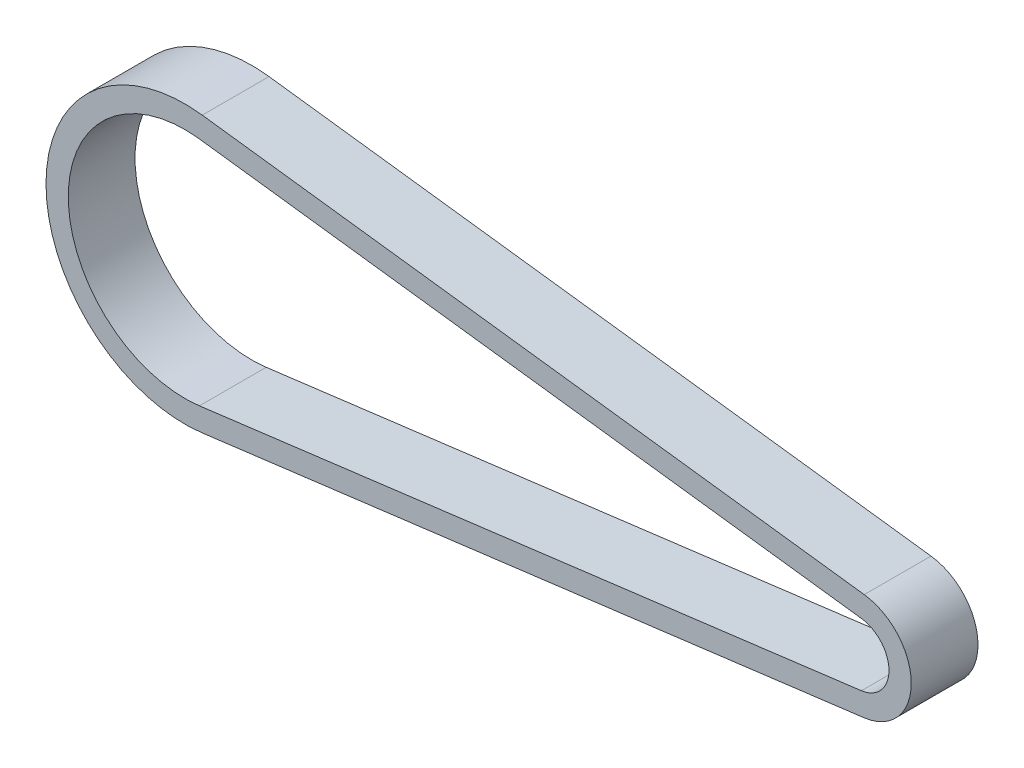
ISO-10303-21;
HEADER;
FILE_DESCRIPTION(('STEP AP214'),'2;1');
FILE_NAME('part.step','',(''),(''),'','','');
FILE_SCHEMA(('AUTOMOTIVE_DESIGN { 1 0 10303 214 1 1 1 1 }'));
ENDSEC;
DATA;
#1=APPLICATION_CONTEXT('core data for automotive mechanical design processes');
#2=APPLICATION_PROTOCOL_DEFINITION('international standard','automotive_design',2000,#1);
#3=PRODUCT_CONTEXT('',#1,'mechanical');
#4=PRODUCT('Part','Part','',(#3));
#5=PRODUCT_RELATED_PRODUCT_CATEGORY('part','',(#4));
#6=PRODUCT_DEFINITION_FORMATION('','',#4);
#7=PRODUCT_DEFINITION_CONTEXT('part definition',#1,'design');
#8=PRODUCT_DEFINITION('design','',#6,#7);
#9=PRODUCT_DEFINITION_SHAPE('','',#8);
#10=(LENGTH_UNIT() NAMED_UNIT(*) SI_UNIT(.MILLI.,.METRE.));
#11=(NAMED_UNIT(*) PLANE_ANGLE_UNIT() SI_UNIT($,.RADIAN.));
#12=(NAMED_UNIT(*) SI_UNIT($,.STERADIAN.) SOLID_ANGLE_UNIT());
#13=UNCERTAINTY_MEASURE_WITH_UNIT(LENGTH_MEASURE(1.E-05),#10,'distance_accuracy_value','');
#14=(GEOMETRIC_REPRESENTATION_CONTEXT(3) GLOBAL_UNCERTAINTY_ASSIGNED_CONTEXT((#13)) GLOBAL_UNIT_ASSIGNED_CONTEXT((#10,
#11,#12)) REPRESENTATION_CONTEXT('',''));
#15=CARTESIAN_POINT('',(0.,0.,0.));
#16=DIRECTION('',(0.,0.,1.));
#17=DIRECTION('',(1.,0.,0.));
#18=AXIS2_PLACEMENT_3D('',#15,#16,#17);
#19=CARTESIAN_POINT('',(90.67602,0.,4.5));
#20=DIRECTION('',(0.,0.,-1.));
#21=DIRECTION('',(-1.,0.,0.));
#22=AXIS2_PLACEMENT_3D('',#19,#20,#21);
#23=CYLINDRICAL_SURFACE('',#22,4.25);
#24=CARTESIAN_POINT('',(90.67602,0.,-4.5));
#25=DIRECTION('',(0.,0.,1.));
#26=DIRECTION('',(1.,0.,0.));
#27=AXIS2_PLACEMENT_3D('',#24,#25,#26);
#28=CIRCLE('',#27,4.25);
#29=CARTESIAN_POINT('',(91.2126833868579,-4.21598059877013,-4.5));
#30=VERTEX_POINT('',#29);
#31=CARTESIAN_POINT('',(91.2126833868579,4.21598059877013,-4.5));
#32=VERTEX_POINT('',#31);
#33=EDGE_CURVE('E143',#30,#32,#28,.T.);
#34=ORIENTED_EDGE('',*,*,#33,.F.);
#35=DIRECTION('',(0.,0.,-1.));
#36=VECTOR('',#35,1.);
#37=CARTESIAN_POINT('',(91.2126833868579,-4.21598059877013,4.5));
#38=LINE('',#37,#36);
#39=CARTESIAN_POINT('',(91.2126833868579,-4.21598059877013,4.5));
#40=VERTEX_POINT('',#39);
#41=EDGE_CURVE('E11',#40,#30,#38,.T.);
#42=ORIENTED_EDGE('',*,*,#41,.F.);
#43=CARTESIAN_POINT('',(90.67602,0.,4.5));
#44=DIRECTION('',(0.,0.,1.));
#45=DIRECTION('',(1.,0.,0.));
#46=AXIS2_PLACEMENT_3D('',#43,#44,#45);
#47=CIRCLE('',#46,4.25);
#48=CARTESIAN_POINT('',(91.2126833868579,4.21598059877013,4.5));
#49=VERTEX_POINT('',#48);
#50=EDGE_CURVE('E114',#40,#49,#47,.T.);
#51=ORIENTED_EDGE('',*,*,#50,.T.);
#52=DIRECTION('',(0.,0.,-1.));
#53=VECTOR('',#52,1.);
#54=CARTESIAN_POINT('',(91.2126833868579,4.21598059877013,4.5));
#55=LINE('',#54,#53);
#56=EDGE_CURVE('E88',#49,#32,#55,.T.);
#57=ORIENTED_EDGE('',*,*,#56,.T.);
#58=EDGE_LOOP('',(#34,#42,#51,#57));
#59=FACE_BOUND('',#58,.T.);
#60=ADVANCED_FACE('F35',(#59),#23,.F.);
#61=CARTESIAN_POINT('',(1.98249768792234,-15.5743283295744,4.5));
#62=DIRECTION('',(0.126273738084226,-0.991995435004737,0.));
#63=DIRECTION('',(0.991995435004737,0.126273738084226,0.));
#64=AXIS2_PLACEMENT_3D('',#61,#62,#63);
#65=PLANE('',#64);
#66=DIRECTION('',(-0.991995435004737,-0.126273738084226,0.));
#67=VECTOR('',#66,1.);
#68=CARTESIAN_POINT('',(1.98249768792234,-15.5743283295744,-4.5));
#69=LINE('',#68,#67);
#70=CARTESIAN_POINT('',(1.98249768792231,-15.5743283295744,-4.5));
#71=VERTEX_POINT('',#70);
#72=EDGE_CURVE('E120',#30,#71,#69,.T.);
#73=ORIENTED_EDGE('',*,*,#72,.T.);
#74=DIRECTION('',(0.,0.,-1.));
#75=VECTOR('',#74,1.);
#76=CARTESIAN_POINT('',(1.98249768792231,-15.5743283295744,4.5));
#77=LINE('',#76,#75);
#78=CARTESIAN_POINT('',(1.98249768792231,-15.5743283295744,4.5));
#79=VERTEX_POINT('',#78);
#80=EDGE_CURVE('E45',#79,#71,#77,.T.);
#81=ORIENTED_EDGE('',*,*,#80,.F.);
#82=DIRECTION('',(-0.991995435004737,-0.126273738084226,0.));
#83=VECTOR('',#82,1.);
#84=CARTESIAN_POINT('',(1.98249768792234,-15.5743283295744,4.5));
#85=LINE('',#84,#83);
#86=EDGE_CURVE('E109',#40,#79,#85,.T.);
#87=ORIENTED_EDGE('',*,*,#86,.F.);
#88=ORIENTED_EDGE('',*,*,#41,.T.);
#89=EDGE_LOOP('',(#73,#81,#87,#88));
#90=FACE_BOUND('',#89,.T.);
#91=ADVANCED_FACE('F118',(#90),#65,.F.);
#92=CARTESIAN_POINT('',(0.,0.,4.5));
#93=DIRECTION('',(0.,0.,-1.));
#94=DIRECTION('',(-1.,0.,0.));
#95=AXIS2_PLACEMENT_3D('',#92,#93,#94);
#96=CYLINDRICAL_SURFACE('',#95,15.7);
#97=CARTESIAN_POINT('',(0.,0.,-4.5));
#98=DIRECTION('',(0.,0.,1.));
#99=DIRECTION('',(1.,0.,0.));
#100=AXIS2_PLACEMENT_3D('',#97,#98,#99);
#101=CIRCLE('',#100,15.7);
#102=CARTESIAN_POINT('',(1.98249768792234,15.5743283295744,-4.5));
#103=VERTEX_POINT('',#102);
#104=EDGE_CURVE('E147',#103,#71,#101,.T.);
#105=ORIENTED_EDGE('',*,*,#104,.F.);
#106=DIRECTION('',(0.,0.,-1.));
#107=VECTOR('',#106,1.);
#108=CARTESIAN_POINT('',(1.98249768792234,15.5743283295744,4.5));
#109=LINE('',#108,#107);
#110=CARTESIAN_POINT('',(1.98249768792234,15.5743283295744,4.5));
#111=VERTEX_POINT('',#110);
#112=EDGE_CURVE('E81',#111,#103,#109,.T.);
#113=ORIENTED_EDGE('',*,*,#112,.F.);
#114=CARTESIAN_POINT('',(0.,0.,4.5));
#115=DIRECTION('',(0.,0.,1.));
#116=DIRECTION('',(1.,0.,0.));
#117=AXIS2_PLACEMENT_3D('',#114,#115,#116);
#118=CIRCLE('',#117,15.7);
#119=EDGE_CURVE('E113',#111,#79,#118,.T.);
#120=ORIENTED_EDGE('',*,*,#119,.T.);
#121=ORIENTED_EDGE('',*,*,#80,.T.);
#122=EDGE_LOOP('',(#105,#113,#120,#121));
#123=FACE_BOUND('',#122,.T.);
#124=ADVANCED_FACE('F125',(#123),#96,.F.);
#125=CARTESIAN_POINT('',(2.36131890217502,18.5503146345886,4.5));
#126=DIRECTION('',(0.126273738084226,0.991995435004737,0.));
#127=DIRECTION('',(-0.991995435004737,0.126273738084226,0.));
#128=AXIS2_PLACEMENT_3D('',#125,#126,#127);
#129=PLANE('',#128);
#130=DIRECTION('',(0.991995435004737,-0.126273738084226,0.));
#131=VECTOR('',#130,1.);
#132=CARTESIAN_POINT('',(2.36131890217502,18.5503146345886,-4.5));
#133=LINE('',#132,#131);
#134=CARTESIAN_POINT('',(2.36131890217502,18.5503146345886,-4.5));
#135=VERTEX_POINT('',#134);
#136=CARTESIAN_POINT('',(91.5915046011106,7.19196690378434,-4.5));
#137=VERTEX_POINT('',#136);
#138=EDGE_CURVE('E131',#135,#137,#133,.T.);
#139=ORIENTED_EDGE('',*,*,#138,.F.);
#140=DIRECTION('',(0.,0.,-1.));
#141=VECTOR('',#140,1.);
#142=CARTESIAN_POINT('',(2.36131890217502,18.5503146345886,4.5));
#143=LINE('',#142,#141);
#144=CARTESIAN_POINT('',(2.36131890217502,18.5503146345886,4.5));
#145=VERTEX_POINT('',#144);
#146=EDGE_CURVE('E39',#145,#135,#143,.T.);
#147=ORIENTED_EDGE('',*,*,#146,.F.);
#148=DIRECTION('',(0.991995435004737,-0.126273738084226,0.));
#149=VECTOR('',#148,1.);
#150=CARTESIAN_POINT('',(2.36131890217502,18.5503146345886,4.5));
#151=LINE('',#150,#149);
#152=CARTESIAN_POINT('',(91.5915046011106,7.19196690378434,4.5));
#153=VERTEX_POINT('',#152);
#154=EDGE_CURVE('E151',#145,#153,#151,.T.);
#155=ORIENTED_EDGE('',*,*,#154,.T.);
#156=DIRECTION('',(0.,0.,-1.));
#157=VECTOR('',#156,1.);
#158=CARTESIAN_POINT('',(91.5915046011106,7.19196690378434,4.5));
#159=LINE('',#158,#157);
#160=EDGE_CURVE('E127',#153,#137,#159,.T.);
#161=ORIENTED_EDGE('',*,*,#160,.T.);
#162=EDGE_LOOP('',(#139,#147,#155,#161));
#163=FACE_BOUND('',#162,.T.);
#164=ADVANCED_FACE('F37',(#163),#129,.T.);
#165=CARTESIAN_POINT('',(0.,0.,4.5));
#166=DIRECTION('',(0.,0.,-1.));
#167=DIRECTION('',(-1.,0.,0.));
#168=AXIS2_PLACEMENT_3D('',#165,#166,#167);
#169=CYLINDRICAL_SURFACE('',#168,18.7);
#170=CARTESIAN_POINT('',(0.,0.,-4.5));
#171=DIRECTION('',(0.,0.,1.));
#172=DIRECTION('',(1.,0.,0.));
#173=AXIS2_PLACEMENT_3D('',#170,#171,#172);
#174=CIRCLE('',#173,18.7);
#175=CARTESIAN_POINT('',(2.36131890217499,-18.5503146345886,-4.5));
#176=VERTEX_POINT('',#175);
#177=EDGE_CURVE('E134',#135,#176,#174,.T.);
#178=ORIENTED_EDGE('',*,*,#177,.T.);
#179=DIRECTION('',(0.,0.,-1.));
#180=VECTOR('',#179,1.);
#181=CARTESIAN_POINT('',(2.36131890217499,-18.5503146345886,4.5));
#182=LINE('',#181,#180);
#183=CARTESIAN_POINT('',(2.36131890217499,-18.5503146345886,4.5));
#184=VERTEX_POINT('',#183);
#185=EDGE_CURVE('E156',#184,#176,#182,.T.);
#186=ORIENTED_EDGE('',*,*,#185,.F.);
#187=CARTESIAN_POINT('',(0.,0.,4.5));
#188=DIRECTION('',(0.,0.,1.));
#189=DIRECTION('',(1.,0.,0.));
#190=AXIS2_PLACEMENT_3D('',#187,#188,#189);
#191=CIRCLE('',#190,18.7);
#192=EDGE_CURVE('E164',#145,#184,#191,.T.);
#193=ORIENTED_EDGE('',*,*,#192,.F.);
#194=ORIENTED_EDGE('',*,*,#146,.T.);
#195=EDGE_LOOP('',(#178,#186,#193,#194));
#196=FACE_BOUND('',#195,.T.);
#197=ADVANCED_FACE('F163',(#196),#169,.T.);
#198=CARTESIAN_POINT('',(2.36131890217502,-18.5503146345886,4.5));
#199=DIRECTION('',(0.126273738084226,-0.991995435004737,0.));
#200=DIRECTION('',(0.991995435004737,0.126273738084226,0.));
#201=AXIS2_PLACEMENT_3D('',#198,#199,#200);
#202=PLANE('',#201);
#203=DIRECTION('',(-0.991995435004737,-0.126273738084226,0.));
#204=VECTOR('',#203,1.);
#205=CARTESIAN_POINT('',(2.36131890217502,-18.5503146345886,-4.5));
#206=LINE('',#205,#204);
#207=CARTESIAN_POINT('',(91.5915046011106,-7.19196690378434,-4.5));
#208=VERTEX_POINT('',#207);
#209=EDGE_CURVE('E137',#208,#176,#206,.T.);
#210=ORIENTED_EDGE('',*,*,#209,.F.);
#211=DIRECTION('',(0.,0.,-1.));
#212=VECTOR('',#211,1.);
#213=CARTESIAN_POINT('',(91.5915046011106,-7.19196690378434,4.5));
#214=LINE('',#213,#212);
#215=CARTESIAN_POINT('',(91.5915046011106,-7.19196690378434,4.5));
#216=VERTEX_POINT('',#215);
#217=EDGE_CURVE('E155',#216,#208,#214,.T.);
#218=ORIENTED_EDGE('',*,*,#217,.F.);
#219=DIRECTION('',(-0.991995435004737,-0.126273738084226,0.));
#220=VECTOR('',#219,1.);
#221=CARTESIAN_POINT('',(2.36131890217502,-18.5503146345886,4.5));
#222=LINE('',#221,#220);
#223=EDGE_CURVE('E176',#216,#184,#222,.T.);
#224=ORIENTED_EDGE('',*,*,#223,.T.);
#225=ORIENTED_EDGE('',*,*,#185,.T.);
#226=EDGE_LOOP('',(#210,#218,#224,#225));
#227=FACE_BOUND('',#226,.T.);
#228=ADVANCED_FACE('F174',(#227),#202,.T.);
#229=CARTESIAN_POINT('',(90.67602,0.,4.5));
#230=DIRECTION('',(0.,0.,-1.));
#231=DIRECTION('',(-1.,0.,0.));
#232=AXIS2_PLACEMENT_3D('',#229,#230,#231);
#233=CYLINDRICAL_SURFACE('',#232,7.25000000000001);
#234=CARTESIAN_POINT('',(90.67602,0.,-4.5));
#235=DIRECTION('',(0.,0.,1.));
#236=DIRECTION('',(1.,0.,0.));
#237=AXIS2_PLACEMENT_3D('',#234,#235,#236);
#238=CIRCLE('',#237,7.25000000000001);
#239=EDGE_CURVE('E140',#208,#137,#238,.T.);
#240=ORIENTED_EDGE('',*,*,#239,.T.);
#241=ORIENTED_EDGE('',*,*,#160,.F.);
#242=CARTESIAN_POINT('',(90.67602,0.,4.5));
#243=DIRECTION('',(0.,0.,1.));
#244=DIRECTION('',(1.,0.,0.));
#245=AXIS2_PLACEMENT_3D('',#242,#243,#244);
#246=CIRCLE('',#245,7.25000000000001);
#247=EDGE_CURVE('E177',#216,#153,#246,.T.);
#248=ORIENTED_EDGE('',*,*,#247,.F.);
#249=ORIENTED_EDGE('',*,*,#217,.T.);
#250=EDGE_LOOP('',(#240,#241,#248,#249));
#251=FACE_BOUND('',#250,.T.);
#252=ADVANCED_FACE('F173',(#251),#233,.T.);
#253=CARTESIAN_POINT('',(1.98249768792234,15.5743283295744,4.5));
#254=DIRECTION('',(0.126273738084226,0.991995435004737,0.));
#255=DIRECTION('',(-0.991995435004737,0.126273738084226,0.));
#256=AXIS2_PLACEMENT_3D('',#253,#254,#255);
#257=PLANE('',#256);
#258=DIRECTION('',(0.991995435004737,-0.126273738084226,0.));
#259=VECTOR('',#258,1.);
#260=CARTESIAN_POINT('',(1.98249768792234,15.5743283295744,-4.5));
#261=LINE('',#260,#259);
#262=EDGE_CURVE('E149',#103,#32,#261,.T.);
#263=ORIENTED_EDGE('',*,*,#262,.T.);
#264=ORIENTED_EDGE('',*,*,#56,.F.);
#265=DIRECTION('',(0.991995435004737,-0.126273738084226,0.));
#266=VECTOR('',#265,1.);
#267=CARTESIAN_POINT('',(1.98249768792234,15.5743283295744,4.5));
#268=LINE('',#267,#266);
#269=EDGE_CURVE('E54',#111,#49,#268,.T.);
#270=ORIENTED_EDGE('',*,*,#269,.F.);
#271=ORIENTED_EDGE('',*,*,#112,.T.);
#272=EDGE_LOOP('',(#263,#264,#270,#271));
#273=FACE_BOUND('',#272,.T.);
#274=ADVANCED_FACE('F183',(#273),#257,.F.);
#275=CARTESIAN_POINT('',(0.,0.,4.5));
#276=DIRECTION('',(0.,0.,1.));
#277=DIRECTION('',(1.,0.,0.));
#278=AXIS2_PLACEMENT_3D('',#275,#276,#277);
#279=PLANE('',#278);
#280=ORIENTED_EDGE('',*,*,#154,.F.);
#281=ORIENTED_EDGE('',*,*,#192,.T.);
#282=ORIENTED_EDGE('',*,*,#223,.F.);
#283=ORIENTED_EDGE('',*,*,#247,.T.);
#284=EDGE_LOOP('',(#280,#281,#282,#283));
#285=FACE_BOUND('',#284,.T.);
#286=ORIENTED_EDGE('',*,*,#50,.F.);
#287=ORIENTED_EDGE('',*,*,#86,.T.);
#288=ORIENTED_EDGE('',*,*,#119,.F.);
#289=ORIENTED_EDGE('',*,*,#269,.T.);
#290=EDGE_LOOP('',(#286,#287,#288,#289));
#291=FACE_BOUND('',#290,.T.);
#292=ADVANCED_FACE('F111',(#285,#291),#279,.T.);
#293=CARTESIAN_POINT('',(0.,0.,-4.5));
#294=DIRECTION('',(0.,0.,1.));
#295=DIRECTION('',(1.,0.,0.));
#296=AXIS2_PLACEMENT_3D('',#293,#294,#295);
#297=PLANE('',#296);
#298=ORIENTED_EDGE('',*,*,#138,.T.);
#299=ORIENTED_EDGE('',*,*,#239,.F.);
#300=ORIENTED_EDGE('',*,*,#209,.T.);
#301=ORIENTED_EDGE('',*,*,#177,.F.);
#302=EDGE_LOOP('',(#298,#299,#300,#301));
#303=FACE_BOUND('',#302,.T.);
#304=ORIENTED_EDGE('',*,*,#33,.T.);
#305=ORIENTED_EDGE('',*,*,#262,.F.);
#306=ORIENTED_EDGE('',*,*,#104,.T.);
#307=ORIENTED_EDGE('',*,*,#72,.F.);
#308=EDGE_LOOP('',(#304,#305,#306,#307));
#309=FACE_BOUND('',#308,.T.);
#310=ADVANCED_FACE('F167',(#303,#309),#297,.F.);
#311=CLOSED_SHELL('',(#60,#91,#124,#164,#197,#228,#252,#274,#292,#310));
#312=MANIFOLD_SOLID_BREP('B2',#311);
#313=ADVANCED_BREP_SHAPE_REPRESENTATION('',(#18,#312),#14);
#314=SHAPE_DEFINITION_REPRESENTATION(#9,#313);
ENDSEC;
END-ISO-10303-21;
